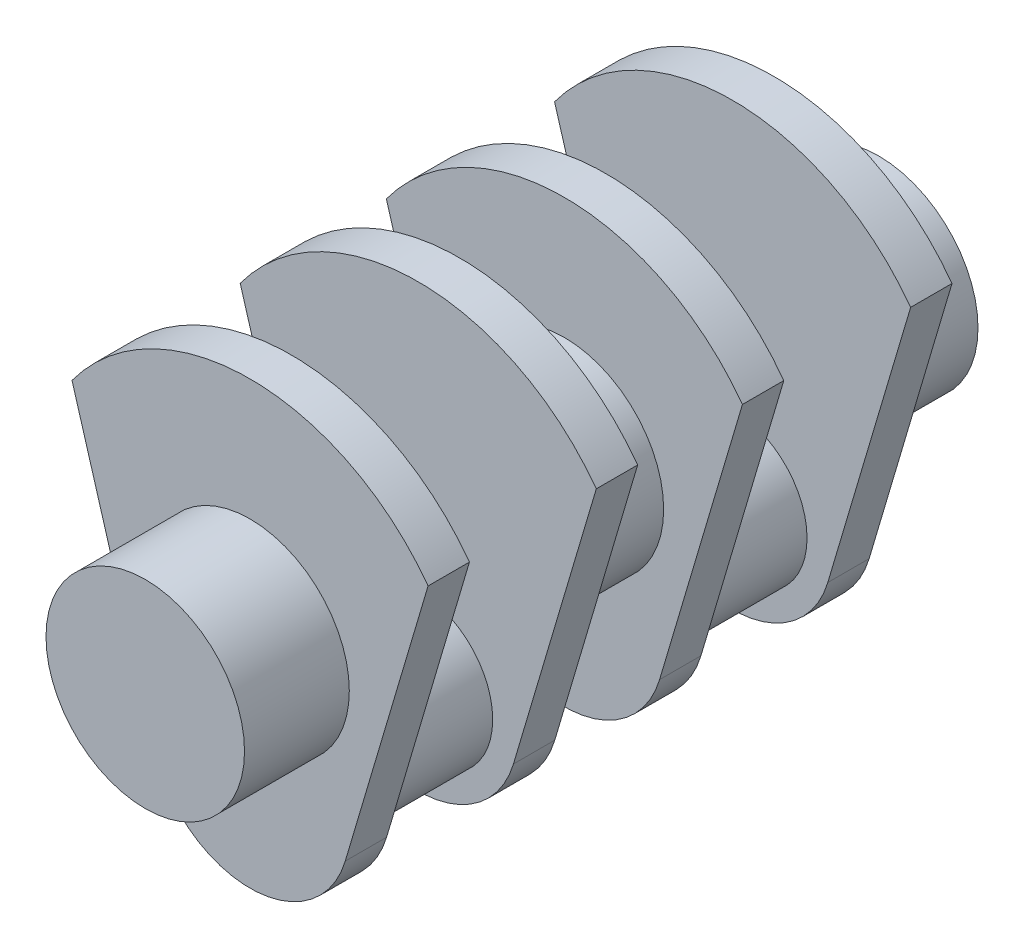
ISO-10303-21;
HEADER;
FILE_DESCRIPTION(('STEP AP214'),'2;1');
FILE_NAME('part.step','',(''),(''),'','','');
FILE_SCHEMA(('AUTOMOTIVE_DESIGN { 1 0 10303 214 1 1 1 1 }'));
ENDSEC;
DATA;
#1=APPLICATION_CONTEXT('core data for automotive mechanical design processes');
#2=APPLICATION_PROTOCOL_DEFINITION('international standard','automotive_design',2000,#1);
#3=PRODUCT_CONTEXT('',#1,'mechanical');
#4=PRODUCT('Part','Part','',(#3));
#5=PRODUCT_RELATED_PRODUCT_CATEGORY('part','',(#4));
#6=PRODUCT_DEFINITION_FORMATION('','',#4);
#7=PRODUCT_DEFINITION_CONTEXT('part definition',#1,'design');
#8=PRODUCT_DEFINITION('design','',#6,#7);
#9=PRODUCT_DEFINITION_SHAPE('','',#8);
#10=(LENGTH_UNIT() NAMED_UNIT(*) SI_UNIT(.MILLI.,.METRE.));
#11=(NAMED_UNIT(*) PLANE_ANGLE_UNIT() SI_UNIT($,.RADIAN.));
#12=(NAMED_UNIT(*) SI_UNIT($,.STERADIAN.) SOLID_ANGLE_UNIT());
#13=UNCERTAINTY_MEASURE_WITH_UNIT(LENGTH_MEASURE(1.E-05),#10,'distance_accuracy_value','');
#14=(GEOMETRIC_REPRESENTATION_CONTEXT(3) GLOBAL_UNCERTAINTY_ASSIGNED_CONTEXT((#13)) GLOBAL_UNIT_ASSIGNED_CONTEXT((#10,
#11,#12)) REPRESENTATION_CONTEXT('',''));
#15=CARTESIAN_POINT('',(0.,0.,0.));
#16=DIRECTION('',(0.,0.,1.));
#17=DIRECTION('',(1.,0.,0.));
#18=AXIS2_PLACEMENT_3D('',#15,#16,#17);
#19=CARTESIAN_POINT('',(-64.5698934752722,47.2305923802783,15.));
#20=DIRECTION('',(0.958819734868192,0.284015344703924,0.));
#21=DIRECTION('',(-0.284015344703924,0.958819734868193,0.));
#22=AXIS2_PLACEMENT_3D('',#19,#20,#21);
#23=PLANE('',#22);
#24=DIRECTION('',(0.284015344703924,-0.958819734868192,0.));
#25=VECTOR('',#24,1.);
#26=CARTESIAN_POINT('',(-64.5698934752722,47.2305923802783,0.));
#27=LINE('',#26,#25);
#28=CARTESIAN_POINT('',(-64.5698934752722,47.2305923802783,0.));
#29=VERTEX_POINT('',#28);
#30=CARTESIAN_POINT('',(-34.5175104552549,-54.2245524093412,0.));
#31=VERTEX_POINT('',#30);
#32=EDGE_CURVE('E334',#29,#31,#27,.T.);
#33=ORIENTED_EDGE('',*,*,#32,.T.);
#34=DIRECTION('',(0.,0.,-1.));
#35=VECTOR('',#34,1.);
#36=CARTESIAN_POINT('',(-34.5175104552549,-54.2245524093412,15.));
#37=LINE('',#36,#35);
#38=CARTESIAN_POINT('',(-34.5175104552549,-54.2245524093412,15.));
#39=VERTEX_POINT('',#38);
#40=EDGE_CURVE('E48',#39,#31,#37,.T.);
#41=ORIENTED_EDGE('',*,*,#40,.F.);
#42=DIRECTION('',(0.284015344703924,-0.958819734868192,0.));
#43=VECTOR('',#42,1.);
#44=CARTESIAN_POINT('',(-64.5698934752722,47.2305923802783,15.));
#45=LINE('',#44,#43);
#46=CARTESIAN_POINT('',(-64.5698934752722,47.2305923802783,15.));
#47=VERTEX_POINT('',#46);
#48=EDGE_CURVE('E338',#47,#39,#45,.T.);
#49=ORIENTED_EDGE('',*,*,#48,.F.);
#50=DIRECTION('',(0.,0.,-1.));
#51=VECTOR('',#50,1.);
#52=CARTESIAN_POINT('',(-64.5698934752722,47.2305923802783,15.));
#53=LINE('',#52,#51);
#54=EDGE_CURVE('E63',#47,#29,#53,.T.);
#55=ORIENTED_EDGE('',*,*,#54,.T.);
#56=EDGE_LOOP('',(#33,#41,#49,#55));
#57=FACE_BOUND('',#56,.T.);
#58=ADVANCED_FACE('F45',(#57),#23,.F.);
#59=CARTESIAN_POINT('',(0.,-44.,15.));
#60=DIRECTION('',(0.,0.,-1.));
#61=DIRECTION('',(-1.,0.,0.));
#62=AXIS2_PLACEMENT_3D('',#59,#60,#61);
#63=CYLINDRICAL_SURFACE('',#62,36.);
#64=CARTESIAN_POINT('',(0.,-44.,0.));
#65=DIRECTION('',(0.,0.,1.));
#66=DIRECTION('',(1.,0.,0.));
#67=AXIS2_PLACEMENT_3D('',#64,#65,#66);
#68=CIRCLE('',#67,36.);
#69=CARTESIAN_POINT('',(34.517510455255,-54.2245524093412,0.));
#70=VERTEX_POINT('',#69);
#71=EDGE_CURVE('E353',#31,#70,#68,.T.);
#72=ORIENTED_EDGE('',*,*,#71,.T.);
#73=DIRECTION('',(0.,0.,-1.));
#74=VECTOR('',#73,1.);
#75=CARTESIAN_POINT('',(34.517510455255,-54.2245524093412,15.));
#76=LINE('',#75,#74);
#77=CARTESIAN_POINT('',(34.517510455255,-54.2245524093412,15.));
#78=VERTEX_POINT('',#77);
#79=EDGE_CURVE('E367',#78,#70,#76,.T.);
#80=ORIENTED_EDGE('',*,*,#79,.F.);
#81=CARTESIAN_POINT('',(0.,-44.,15.));
#82=DIRECTION('',(0.,0.,1.));
#83=DIRECTION('',(1.,0.,0.));
#84=AXIS2_PLACEMENT_3D('',#81,#82,#83);
#85=CIRCLE('',#84,36.);
#86=EDGE_CURVE('E90',#39,#78,#85,.T.);
#87=ORIENTED_EDGE('',*,*,#86,.F.);
#88=ORIENTED_EDGE('',*,*,#40,.T.);
#89=EDGE_LOOP('',(#72,#80,#87,#88));
#90=FACE_BOUND('',#89,.T.);
#91=ADVANCED_FACE('F372',(#90),#63,.T.);
#92=CARTESIAN_POINT('',(64.5698934752721,47.2305923802784,15.));
#93=DIRECTION('',(0.958819734868193,-0.284015344703923,0.));
#94=DIRECTION('',(0.284015344703923,0.958819734868193,0.));
#95=AXIS2_PLACEMENT_3D('',#92,#93,#94);
#96=PLANE('',#95);
#97=DIRECTION('',(-0.284015344703923,-0.958819734868193,0.));
#98=VECTOR('',#97,1.);
#99=CARTESIAN_POINT('',(64.5698934752721,47.2305923802784,0.));
#100=LINE('',#99,#98);
#101=CARTESIAN_POINT('',(64.5698934752721,47.2305923802784,0.));
#102=VERTEX_POINT('',#101);
#103=EDGE_CURVE('E357',#102,#70,#100,.T.);
#104=ORIENTED_EDGE('',*,*,#103,.F.);
#105=DIRECTION('',(0.,0.,-1.));
#106=VECTOR('',#105,1.);
#107=CARTESIAN_POINT('',(64.5698934752721,47.2305923802784,15.));
#108=LINE('',#107,#106);
#109=CARTESIAN_POINT('',(64.5698934752721,47.2305923802784,15.));
#110=VERTEX_POINT('',#109);
#111=EDGE_CURVE('E78',#110,#102,#108,.T.);
#112=ORIENTED_EDGE('',*,*,#111,.F.);
#113=DIRECTION('',(-0.284015344703923,-0.958819734868193,0.));
#114=VECTOR('',#113,1.);
#115=CARTESIAN_POINT('',(64.5698934752721,47.2305923802784,15.));
#116=LINE('',#115,#114);
#117=EDGE_CURVE('E344',#110,#78,#116,.T.);
#118=ORIENTED_EDGE('',*,*,#117,.T.);
#119=ORIENTED_EDGE('',*,*,#79,.T.);
#120=EDGE_LOOP('',(#104,#112,#118,#119));
#121=FACE_BOUND('',#120,.T.);
#122=ADVANCED_FACE('F378',(#121),#96,.T.);
#123=CARTESIAN_POINT('',(0.,0.,15.));
#124=DIRECTION('',(0.,0.,-1.));
#125=DIRECTION('',(-1.,0.,0.));
#126=AXIS2_PLACEMENT_3D('',#123,#124,#125);
#127=CYLINDRICAL_SURFACE('',#126,80.);
#128=CARTESIAN_POINT('',(0.,0.,0.));
#129=DIRECTION('',(0.,0.,-1.));
#130=DIRECTION('',(-1.,0.,0.));
#131=AXIS2_PLACEMENT_3D('',#128,#129,#130);
#132=CIRCLE('',#131,80.);
#133=EDGE_CURVE('E341',#29,#102,#132,.T.);
#134=ORIENTED_EDGE('',*,*,#133,.F.);
#135=ORIENTED_EDGE('',*,*,#54,.F.);
#136=CARTESIAN_POINT('',(0.,0.,15.));
#137=DIRECTION('',(0.,0.,-1.));
#138=DIRECTION('',(-1.,0.,0.));
#139=AXIS2_PLACEMENT_3D('',#136,#137,#138);
#140=CIRCLE('',#139,80.);
#141=EDGE_CURVE('E348',#47,#110,#140,.T.);
#142=ORIENTED_EDGE('',*,*,#141,.T.);
#143=ORIENTED_EDGE('',*,*,#111,.T.);
#144=EDGE_LOOP('',(#134,#135,#142,#143));
#145=FACE_BOUND('',#144,.T.);
#146=ADVANCED_FACE('F375',(#145),#127,.T.);
#147=CARTESIAN_POINT('',(0.,-44.,15.));
#148=DIRECTION('',(0.,0.,1.));
#149=DIRECTION('',(1.,0.,0.));
#150=AXIS2_PLACEMENT_3D('',#147,#148,#149);
#151=PLANE('',#150);
#152=CARTESIAN_POINT('',(0.,-44.,15.));
#153=DIRECTION('',(0.,0.,1.));
#154=DIRECTION('',(1.,0.,0.));
#155=AXIS2_PLACEMENT_3D('',#152,#153,#154);
#156=CIRCLE('',#155,27.);
#157=CARTESIAN_POINT('',(27.,-44.,15.));
#158=VERTEX_POINT('',#157);
#159=EDGE_CURVE('E328',#158,#158,#156,.T.);
#160=ORIENTED_EDGE('',*,*,#159,.F.);
#161=EDGE_LOOP('',(#160));
#162=FACE_BOUND('',#161,.T.);
#163=ORIENTED_EDGE('',*,*,#48,.T.);
#164=ORIENTED_EDGE('',*,*,#86,.T.);
#165=ORIENTED_EDGE('',*,*,#117,.F.);
#166=ORIENTED_EDGE('',*,*,#141,.F.);
#167=EDGE_LOOP('',(#163,#164,#165,#166));
#168=FACE_BOUND('',#167,.T.);
#169=ADVANCED_FACE('F377',(#162,#168),#151,.T.);
#170=CARTESIAN_POINT('',(0.,-44.,0.));
#171=DIRECTION('',(0.,0.,1.));
#172=DIRECTION('',(1.,0.,0.));
#173=AXIS2_PLACEMENT_3D('',#170,#171,#172);
#174=PLANE('',#173);
#175=CARTESIAN_POINT('',(0.,0.,0.));
#176=DIRECTION('',(0.,0.,-1.));
#177=DIRECTION('',(-1.,0.,0.));
#178=AXIS2_PLACEMENT_3D('',#175,#176,#177);
#179=CIRCLE('',#178,36.);
#180=CARTESIAN_POINT('',(-36.,0.,0.));
#181=VERTEX_POINT('',#180);
#182=EDGE_CURVE('E11',#181,#181,#179,.T.);
#183=ORIENTED_EDGE('',*,*,#182,.F.);
#184=EDGE_LOOP('',(#183));
#185=FACE_BOUND('',#184,.T.);
#186=ORIENTED_EDGE('',*,*,#32,.F.);
#187=ORIENTED_EDGE('',*,*,#133,.T.);
#188=ORIENTED_EDGE('',*,*,#103,.T.);
#189=ORIENTED_EDGE('',*,*,#71,.F.);
#190=EDGE_LOOP('',(#186,#187,#188,#189));
#191=FACE_BOUND('',#190,.T.);
#192=ADVANCED_FACE('F374',(#185,#191),#174,.F.);
#193=CARTESIAN_POINT('',(0.,-44.,61.));
#194=DIRECTION('',(0.,0.,-1.));
#195=DIRECTION('',(-1.,0.,0.));
#196=AXIS2_PLACEMENT_3D('',#193,#194,#195);
#197=CYLINDRICAL_SURFACE('',#196,27.);
#198=CARTESIAN_POINT('',(0.,-44.,61.));
#199=DIRECTION('',(0.,0.,1.));
#200=DIRECTION('',(1.,0.,0.));
#201=AXIS2_PLACEMENT_3D('',#198,#199,#200);
#202=CIRCLE('',#201,27.);
#203=CARTESIAN_POINT('',(27.,-44.,61.));
#204=VERTEX_POINT('',#203);
#205=EDGE_CURVE('E330',#204,#204,#202,.T.);
#206=ORIENTED_EDGE('',*,*,#205,.F.);
#207=EDGE_LOOP('',(#206));
#208=FACE_BOUND('',#207,.T.);
#209=ORIENTED_EDGE('',*,*,#159,.T.);
#210=EDGE_LOOP('',(#209));
#211=FACE_BOUND('',#210,.T.);
#212=ADVANCED_FACE('F420',(#208,#211),#197,.T.);
#213=CARTESIAN_POINT('',(0.,0.,-38.));
#214=DIRECTION('',(0.,0.,1.));
#215=DIRECTION('',(1.,0.,0.));
#216=AXIS2_PLACEMENT_3D('',#213,#214,#215);
#217=CYLINDRICAL_SURFACE('',#216,36.);
#218=CARTESIAN_POINT('',(0.,0.,-38.));
#219=DIRECTION('',(0.,0.,-1.));
#220=DIRECTION('',(-1.,0.,0.));
#221=AXIS2_PLACEMENT_3D('',#218,#219,#220);
#222=CIRCLE('',#221,36.);
#223=CARTESIAN_POINT('',(-36.,0.,-38.));
#224=VERTEX_POINT('',#223);
#225=EDGE_CURVE('E325',#224,#224,#222,.T.);
#226=ORIENTED_EDGE('',*,*,#225,.F.);
#227=EDGE_LOOP('',(#226));
#228=FACE_BOUND('',#227,.T.);
#229=ORIENTED_EDGE('',*,*,#182,.T.);
#230=EDGE_LOOP('',(#229));
#231=FACE_BOUND('',#230,.T.);
#232=ADVANCED_FACE('F429',(#228,#231),#217,.T.);
#233=CARTESIAN_POINT('',(0.,0.,-38.));
#234=DIRECTION('',(0.,0.,-1.));
#235=DIRECTION('',(-1.,0.,0.));
#236=AXIS2_PLACEMENT_3D('',#233,#234,#235);
#237=PLANE('',#236);
#238=ORIENTED_EDGE('',*,*,#225,.T.);
#239=EDGE_LOOP('',(#238));
#240=FACE_BOUND('',#239,.T.);
#241=ADVANCED_FACE('F438',(#240),#237,.T.);
#242=CARTESIAN_POINT('',(-64.5698934752722,47.2305923802783,61.));
#243=DIRECTION('',(-0.958819734868192,-0.284015344703924,0.));
#244=DIRECTION('',(0.284015344703924,-0.958819734868193,0.));
#245=AXIS2_PLACEMENT_3D('',#242,#243,#244);
#246=PLANE('',#245);
#247=DIRECTION('',(0.284015344703924,-0.958819734868192,0.));
#248=VECTOR('',#247,1.);
#249=CARTESIAN_POINT('',(-64.5698934752722,47.2305923802783,76.));
#250=LINE('',#249,#248);
#251=CARTESIAN_POINT('',(-64.5698934752722,47.2305923802783,76.));
#252=VERTEX_POINT('',#251);
#253=CARTESIAN_POINT('',(-34.5175104552549,-54.2245524093412,76.));
#254=VERTEX_POINT('',#253);
#255=EDGE_CURVE('E283',#252,#254,#250,.T.);
#256=ORIENTED_EDGE('',*,*,#255,.F.);
#257=DIRECTION('',(0.,0.,1.));
#258=VECTOR('',#257,1.);
#259=CARTESIAN_POINT('',(-64.5698934752722,47.2305923802783,61.));
#260=LINE('',#259,#258);
#261=CARTESIAN_POINT('',(-64.5698934752722,47.2305923802783,61.));
#262=VERTEX_POINT('',#261);
#263=EDGE_CURVE('E322',#262,#252,#260,.T.);
#264=ORIENTED_EDGE('',*,*,#263,.F.);
#265=DIRECTION('',(0.284015344703924,-0.958819734868192,0.));
#266=VECTOR('',#265,1.);
#267=CARTESIAN_POINT('',(-64.5698934752722,47.2305923802783,61.));
#268=LINE('',#267,#266);
#269=CARTESIAN_POINT('',(-34.5175104552549,-54.2245524093412,61.));
#270=VERTEX_POINT('',#269);
#271=EDGE_CURVE('E284',#262,#270,#268,.T.);
#272=ORIENTED_EDGE('',*,*,#271,.T.);
#273=DIRECTION('',(0.,0.,1.));
#274=VECTOR('',#273,1.);
#275=CARTESIAN_POINT('',(-34.5175104552549,-54.2245524093412,61.));
#276=LINE('',#275,#274);
#277=EDGE_CURVE('E299',#270,#254,#276,.T.);
#278=ORIENTED_EDGE('',*,*,#277,.T.);
#279=EDGE_LOOP('',(#256,#264,#272,#278));
#280=FACE_BOUND('',#279,.T.);
#281=ADVANCED_FACE('F448',(#280),#246,.T.);
#282=CARTESIAN_POINT('',(0.,0.,61.));
#283=DIRECTION('',(0.,0.,1.));
#284=DIRECTION('',(1.,0.,0.));
#285=AXIS2_PLACEMENT_3D('',#282,#283,#284);
#286=CYLINDRICAL_SURFACE('',#285,80.);
#287=CARTESIAN_POINT('',(0.,0.,76.));
#288=DIRECTION('',(0.,0.,-1.));
#289=DIRECTION('',(-1.,0.,0.));
#290=AXIS2_PLACEMENT_3D('',#287,#288,#289);
#291=CIRCLE('',#290,80.);
#292=CARTESIAN_POINT('',(64.5698934752721,47.2305923802784,76.));
#293=VERTEX_POINT('',#292);
#294=EDGE_CURVE('E303',#252,#293,#291,.T.);
#295=ORIENTED_EDGE('',*,*,#294,.T.);
#296=DIRECTION('',(0.,0.,1.));
#297=VECTOR('',#296,1.);
#298=CARTESIAN_POINT('',(64.5698934752721,47.2305923802784,61.));
#299=LINE('',#298,#297);
#300=CARTESIAN_POINT('',(64.5698934752721,47.2305923802784,61.));
#301=VERTEX_POINT('',#300);
#302=EDGE_CURVE('E318',#301,#293,#299,.T.);
#303=ORIENTED_EDGE('',*,*,#302,.F.);
#304=CARTESIAN_POINT('',(0.,0.,61.));
#305=DIRECTION('',(0.,0.,-1.));
#306=DIRECTION('',(-1.,0.,0.));
#307=AXIS2_PLACEMENT_3D('',#304,#305,#306);
#308=CIRCLE('',#307,80.);
#309=EDGE_CURVE('E288',#262,#301,#308,.T.);
#310=ORIENTED_EDGE('',*,*,#309,.F.);
#311=ORIENTED_EDGE('',*,*,#263,.T.);
#312=EDGE_LOOP('',(#295,#303,#310,#311));
#313=FACE_BOUND('',#312,.T.);
#314=ADVANCED_FACE('F458',(#313),#286,.T.);
#315=CARTESIAN_POINT('',(64.5698934752721,47.2305923802784,61.));
#316=DIRECTION('',(-0.958819734868193,0.284015344703923,0.));
#317=DIRECTION('',(-0.284015344703923,-0.958819734868193,0.));
#318=AXIS2_PLACEMENT_3D('',#315,#316,#317);
#319=PLANE('',#318);
#320=DIRECTION('',(-0.284015344703923,-0.958819734868193,0.));
#321=VECTOR('',#320,1.);
#322=CARTESIAN_POINT('',(64.5698934752721,47.2305923802784,76.));
#323=LINE('',#322,#321);
#324=CARTESIAN_POINT('',(34.517510455255,-54.2245524093412,76.));
#325=VERTEX_POINT('',#324);
#326=EDGE_CURVE('E306',#293,#325,#323,.T.);
#327=ORIENTED_EDGE('',*,*,#326,.T.);
#328=DIRECTION('',(0.,0.,1.));
#329=VECTOR('',#328,1.);
#330=CARTESIAN_POINT('',(34.517510455255,-54.2245524093412,61.));
#331=LINE('',#330,#329);
#332=CARTESIAN_POINT('',(34.517510455255,-54.2245524093412,61.));
#333=VERTEX_POINT('',#332);
#334=EDGE_CURVE('E315',#333,#325,#331,.T.);
#335=ORIENTED_EDGE('',*,*,#334,.F.);
#336=DIRECTION('',(-0.284015344703923,-0.958819734868193,0.));
#337=VECTOR('',#336,1.);
#338=CARTESIAN_POINT('',(64.5698934752721,47.2305923802784,61.));
#339=LINE('',#338,#337);
#340=EDGE_CURVE('E292',#301,#333,#339,.T.);
#341=ORIENTED_EDGE('',*,*,#340,.F.);
#342=ORIENTED_EDGE('',*,*,#302,.T.);
#343=EDGE_LOOP('',(#327,#335,#341,#342));
#344=FACE_BOUND('',#343,.T.);
#345=ADVANCED_FACE('F468',(#344),#319,.F.);
#346=CARTESIAN_POINT('',(0.,-44.,61.));
#347=DIRECTION('',(0.,0.,1.));
#348=DIRECTION('',(1.,0.,0.));
#349=AXIS2_PLACEMENT_3D('',#346,#347,#348);
#350=CYLINDRICAL_SURFACE('',#349,36.);
#351=CARTESIAN_POINT('',(0.,-44.,76.));
#352=DIRECTION('',(0.,0.,1.));
#353=DIRECTION('',(1.,0.,0.));
#354=AXIS2_PLACEMENT_3D('',#351,#352,#353);
#355=CIRCLE('',#354,36.);
#356=EDGE_CURVE('E289',#254,#325,#355,.T.);
#357=ORIENTED_EDGE('',*,*,#356,.F.);
#358=ORIENTED_EDGE('',*,*,#277,.F.);
#359=CARTESIAN_POINT('',(0.,-44.,61.));
#360=DIRECTION('',(0.,0.,1.));
#361=DIRECTION('',(1.,0.,0.));
#362=AXIS2_PLACEMENT_3D('',#359,#360,#361);
#363=CIRCLE('',#362,36.);
#364=EDGE_CURVE('E295',#270,#333,#363,.T.);
#365=ORIENTED_EDGE('',*,*,#364,.T.);
#366=ORIENTED_EDGE('',*,*,#334,.T.);
#367=EDGE_LOOP('',(#357,#358,#365,#366));
#368=FACE_BOUND('',#367,.T.);
#369=ADVANCED_FACE('F478',(#368),#350,.T.);
#370=CARTESIAN_POINT('',(0.,-44.,61.));
#371=DIRECTION('',(0.,0.,-1.));
#372=DIRECTION('',(1.,0.,0.));
#373=AXIS2_PLACEMENT_3D('',#370,#371,#372);
#374=PLANE('',#373);
#375=ORIENTED_EDGE('',*,*,#205,.T.);
#376=EDGE_LOOP('',(#375));
#377=FACE_BOUND('',#376,.T.);
#378=ORIENTED_EDGE('',*,*,#271,.F.);
#379=ORIENTED_EDGE('',*,*,#309,.T.);
#380=ORIENTED_EDGE('',*,*,#340,.T.);
#381=ORIENTED_EDGE('',*,*,#364,.F.);
#382=EDGE_LOOP('',(#378,#379,#380,#381));
#383=FACE_BOUND('',#382,.T.);
#384=ADVANCED_FACE('F488',(#377,#383),#374,.T.);
#385=CARTESIAN_POINT('',(0.,-44.,76.));
#386=DIRECTION('',(0.,0.,-1.));
#387=DIRECTION('',(1.,0.,0.));
#388=AXIS2_PLACEMENT_3D('',#385,#386,#387);
#389=PLANE('',#388);
#390=CARTESIAN_POINT('',(0.,0.,76.));
#391=DIRECTION('',(0.,0.,-1.));
#392=DIRECTION('',(-1.,0.,0.));
#393=AXIS2_PLACEMENT_3D('',#390,#391,#392);
#394=CIRCLE('',#393,36.);
#395=CARTESIAN_POINT('',(-36.,0.,76.));
#396=VERTEX_POINT('',#395);
#397=EDGE_CURVE('E279',#396,#396,#394,.T.);
#398=ORIENTED_EDGE('',*,*,#397,.T.);
#399=EDGE_LOOP('',(#398));
#400=FACE_BOUND('',#399,.T.);
#401=ORIENTED_EDGE('',*,*,#255,.T.);
#402=ORIENTED_EDGE('',*,*,#356,.T.);
#403=ORIENTED_EDGE('',*,*,#326,.F.);
#404=ORIENTED_EDGE('',*,*,#294,.F.);
#405=EDGE_LOOP('',(#401,#402,#403,#404));
#406=FACE_BOUND('',#405,.T.);
#407=ADVANCED_FACE('F498',(#400,#406),#389,.F.);
#408=CARTESIAN_POINT('',(0.,0.,114.));
#409=DIRECTION('',(0.,0.,-1.));
#410=DIRECTION('',(-1.,0.,0.));
#411=AXIS2_PLACEMENT_3D('',#408,#409,#410);
#412=CYLINDRICAL_SURFACE('',#411,36.);
#413=CARTESIAN_POINT('',(0.,0.,114.));
#414=DIRECTION('',(0.,0.,-1.));
#415=DIRECTION('',(-1.,0.,0.));
#416=AXIS2_PLACEMENT_3D('',#413,#414,#415);
#417=CIRCLE('',#416,36.);
#418=CARTESIAN_POINT('',(-36.,0.,114.));
#419=VERTEX_POINT('',#418);
#420=EDGE_CURVE('E275',#419,#419,#417,.T.);
#421=ORIENTED_EDGE('',*,*,#420,.T.);
#422=EDGE_LOOP('',(#421));
#423=FACE_BOUND('',#422,.T.);
#424=ORIENTED_EDGE('',*,*,#397,.F.);
#425=EDGE_LOOP('',(#424));
#426=FACE_BOUND('',#425,.T.);
#427=ADVANCED_FACE('F508',(#423,#426),#412,.T.);
#428=CARTESIAN_POINT('',(-64.5698934752722,47.2305923802783,129.));
#429=DIRECTION('',(0.958819734868192,0.284015344703924,0.));
#430=DIRECTION('',(-0.284015344703924,0.958819734868193,0.));
#431=AXIS2_PLACEMENT_3D('',#428,#429,#430);
#432=PLANE('',#431);
#433=DIRECTION('',(0.284015344703924,-0.958819734868192,0.));
#434=VECTOR('',#433,1.);
#435=CARTESIAN_POINT('',(-64.5698934752722,47.2305923802783,114.));
#436=LINE('',#435,#434);
#437=CARTESIAN_POINT('',(-64.5698934752722,47.2305923802783,114.));
#438=VERTEX_POINT('',#437);
#439=CARTESIAN_POINT('',(-34.5175104552549,-54.2245524093412,114.));
#440=VERTEX_POINT('',#439);
#441=EDGE_CURVE('E228',#438,#440,#436,.T.);
#442=ORIENTED_EDGE('',*,*,#441,.T.);
#443=DIRECTION('',(0.,0.,-1.));
#444=VECTOR('',#443,1.);
#445=CARTESIAN_POINT('',(-34.5175104552549,-54.2245524093412,129.));
#446=LINE('',#445,#444);
#447=CARTESIAN_POINT('',(-34.5175104552549,-54.2245524093412,129.));
#448=VERTEX_POINT('',#447);
#449=EDGE_CURVE('E271',#448,#440,#446,.T.);
#450=ORIENTED_EDGE('',*,*,#449,.F.);
#451=DIRECTION('',(0.284015344703924,-0.958819734868192,0.));
#452=VECTOR('',#451,1.);
#453=CARTESIAN_POINT('',(-64.5698934752722,47.2305923802783,129.));
#454=LINE('',#453,#452);
#455=CARTESIAN_POINT('',(-64.5698934752722,47.2305923802783,129.));
#456=VERTEX_POINT('',#455);
#457=EDGE_CURVE('E232',#456,#448,#454,.T.);
#458=ORIENTED_EDGE('',*,*,#457,.F.);
#459=DIRECTION('',(0.,0.,-1.));
#460=VECTOR('',#459,1.);
#461=CARTESIAN_POINT('',(-64.5698934752722,47.2305923802783,129.));
#462=LINE('',#461,#460);
#463=EDGE_CURVE('E248',#456,#438,#462,.T.);
#464=ORIENTED_EDGE('',*,*,#463,.T.);
#465=EDGE_LOOP('',(#442,#450,#458,#464));
#466=FACE_BOUND('',#465,.T.);
#467=ADVANCED_FACE('F518',(#466),#432,.F.);
#468=CARTESIAN_POINT('',(0.,-44.,129.));
#469=DIRECTION('',(0.,0.,-1.));
#470=DIRECTION('',(-1.,0.,0.));
#471=AXIS2_PLACEMENT_3D('',#468,#469,#470);
#472=CYLINDRICAL_SURFACE('',#471,36.);
#473=CARTESIAN_POINT('',(0.,-44.,114.));
#474=DIRECTION('',(0.,0.,1.));
#475=DIRECTION('',(1.,0.,0.));
#476=AXIS2_PLACEMENT_3D('',#473,#474,#475);
#477=CIRCLE('',#476,36.);
#478=CARTESIAN_POINT('',(34.517510455255,-54.2245524093412,114.));
#479=VERTEX_POINT('',#478);
#480=EDGE_CURVE('E252',#440,#479,#477,.T.);
#481=ORIENTED_EDGE('',*,*,#480,.T.);
#482=DIRECTION('',(0.,0.,-1.));
#483=VECTOR('',#482,1.);
#484=CARTESIAN_POINT('',(34.517510455255,-54.2245524093412,129.));
#485=LINE('',#484,#483);
#486=CARTESIAN_POINT('',(34.517510455255,-54.2245524093412,129.));
#487=VERTEX_POINT('',#486);
#488=EDGE_CURVE('E268',#487,#479,#485,.T.);
#489=ORIENTED_EDGE('',*,*,#488,.F.);
#490=CARTESIAN_POINT('',(0.,-44.,129.));
#491=DIRECTION('',(0.,0.,1.));
#492=DIRECTION('',(1.,0.,0.));
#493=AXIS2_PLACEMENT_3D('',#490,#491,#492);
#494=CIRCLE('',#493,36.);
#495=EDGE_CURVE('E236',#448,#487,#494,.T.);
#496=ORIENTED_EDGE('',*,*,#495,.F.);
#497=ORIENTED_EDGE('',*,*,#449,.T.);
#498=EDGE_LOOP('',(#481,#489,#496,#497));
#499=FACE_BOUND('',#498,.T.);
#500=ADVANCED_FACE('F528',(#499),#472,.T.);
#501=CARTESIAN_POINT('',(64.5698934752721,47.2305923802784,129.));
#502=DIRECTION('',(0.958819734868193,-0.284015344703923,0.));
#503=DIRECTION('',(0.284015344703923,0.958819734868193,0.));
#504=AXIS2_PLACEMENT_3D('',#501,#502,#503);
#505=PLANE('',#504);
#506=DIRECTION('',(-0.284015344703923,-0.958819734868193,0.));
#507=VECTOR('',#506,1.);
#508=CARTESIAN_POINT('',(64.5698934752721,47.2305923802784,114.));
#509=LINE('',#508,#507);
#510=CARTESIAN_POINT('',(64.5698934752721,47.2305923802784,114.));
#511=VERTEX_POINT('',#510);
#512=EDGE_CURVE('E256',#511,#479,#509,.T.);
#513=ORIENTED_EDGE('',*,*,#512,.F.);
#514=DIRECTION('',(0.,0.,-1.));
#515=VECTOR('',#514,1.);
#516=CARTESIAN_POINT('',(64.5698934752721,47.2305923802784,129.));
#517=LINE('',#516,#515);
#518=CARTESIAN_POINT('',(64.5698934752721,47.2305923802784,129.));
#519=VERTEX_POINT('',#518);
#520=EDGE_CURVE('E265',#519,#511,#517,.T.);
#521=ORIENTED_EDGE('',*,*,#520,.F.);
#522=DIRECTION('',(-0.284015344703923,-0.958819734868193,0.));
#523=VECTOR('',#522,1.);
#524=CARTESIAN_POINT('',(64.5698934752721,47.2305923802784,129.));
#525=LINE('',#524,#523);
#526=EDGE_CURVE('E240',#519,#487,#525,.T.);
#527=ORIENTED_EDGE('',*,*,#526,.T.);
#528=ORIENTED_EDGE('',*,*,#488,.T.);
#529=EDGE_LOOP('',(#513,#521,#527,#528));
#530=FACE_BOUND('',#529,.T.);
#531=ADVANCED_FACE('F538',(#530),#505,.T.);
#532=CARTESIAN_POINT('',(0.,0.,129.));
#533=DIRECTION('',(0.,0.,-1.));
#534=DIRECTION('',(-1.,0.,0.));
#535=AXIS2_PLACEMENT_3D('',#532,#533,#534);
#536=CYLINDRICAL_SURFACE('',#535,80.);
#537=CARTESIAN_POINT('',(0.,0.,114.));
#538=DIRECTION('',(0.,0.,-1.));
#539=DIRECTION('',(-1.,0.,0.));
#540=AXIS2_PLACEMENT_3D('',#537,#538,#539);
#541=CIRCLE('',#540,80.);
#542=EDGE_CURVE('E237',#438,#511,#541,.T.);
#543=ORIENTED_EDGE('',*,*,#542,.F.);
#544=ORIENTED_EDGE('',*,*,#463,.F.);
#545=CARTESIAN_POINT('',(0.,0.,129.));
#546=DIRECTION('',(0.,0.,-1.));
#547=DIRECTION('',(-1.,0.,0.));
#548=AXIS2_PLACEMENT_3D('',#545,#546,#547);
#549=CIRCLE('',#548,80.);
#550=EDGE_CURVE('E244',#456,#519,#549,.T.);
#551=ORIENTED_EDGE('',*,*,#550,.T.);
#552=ORIENTED_EDGE('',*,*,#520,.T.);
#553=EDGE_LOOP('',(#543,#544,#551,#552));
#554=FACE_BOUND('',#553,.T.);
#555=ADVANCED_FACE('F548',(#554),#536,.T.);
#556=CARTESIAN_POINT('',(0.,-44.,129.));
#557=DIRECTION('',(0.,0.,1.));
#558=DIRECTION('',(1.,0.,0.));
#559=AXIS2_PLACEMENT_3D('',#556,#557,#558);
#560=PLANE('',#559);
#561=CARTESIAN_POINT('',(0.,-44.,129.));
#562=DIRECTION('',(0.,0.,1.));
#563=DIRECTION('',(1.,0.,0.));
#564=AXIS2_PLACEMENT_3D('',#561,#562,#563);
#565=CIRCLE('',#564,27.);
#566=CARTESIAN_POINT('',(27.,-44.,129.));
#567=VERTEX_POINT('',#566);
#568=EDGE_CURVE('E177',#567,#567,#565,.T.);
#569=ORIENTED_EDGE('',*,*,#568,.F.);
#570=EDGE_LOOP('',(#569));
#571=FACE_BOUND('',#570,.T.);
#572=ORIENTED_EDGE('',*,*,#457,.T.);
#573=ORIENTED_EDGE('',*,*,#495,.T.);
#574=ORIENTED_EDGE('',*,*,#526,.F.);
#575=ORIENTED_EDGE('',*,*,#550,.F.);
#576=EDGE_LOOP('',(#572,#573,#574,#575));
#577=FACE_BOUND('',#576,.T.);
#578=ADVANCED_FACE('F558',(#571,#577),#560,.T.);
#579=CARTESIAN_POINT('',(0.,-44.,114.));
#580=DIRECTION('',(0.,0.,1.));
#581=DIRECTION('',(1.,0.,0.));
#582=AXIS2_PLACEMENT_3D('',#579,#580,#581);
#583=PLANE('',#582);
#584=ORIENTED_EDGE('',*,*,#420,.F.);
#585=EDGE_LOOP('',(#584));
#586=FACE_BOUND('',#585,.T.);
#587=ORIENTED_EDGE('',*,*,#441,.F.);
#588=ORIENTED_EDGE('',*,*,#542,.T.);
#589=ORIENTED_EDGE('',*,*,#512,.T.);
#590=ORIENTED_EDGE('',*,*,#480,.F.);
#591=EDGE_LOOP('',(#587,#588,#589,#590));
#592=FACE_BOUND('',#591,.T.);
#593=ADVANCED_FACE('F568',(#586,#592),#583,.F.);
#594=CARTESIAN_POINT('',(0.,-44.,175.));
#595=DIRECTION('',(0.,0.,-1.));
#596=DIRECTION('',(-1.,0.,0.));
#597=AXIS2_PLACEMENT_3D('',#594,#595,#596);
#598=CYLINDRICAL_SURFACE('',#597,27.);
#599=CARTESIAN_POINT('',(0.,-44.,175.));
#600=DIRECTION('',(0.,0.,1.));
#601=DIRECTION('',(1.,0.,0.));
#602=AXIS2_PLACEMENT_3D('',#599,#600,#601);
#603=CIRCLE('',#602,27.);
#604=CARTESIAN_POINT('',(27.,-44.,175.));
#605=VERTEX_POINT('',#604);
#606=EDGE_CURVE('E224',#605,#605,#603,.T.);
#607=ORIENTED_EDGE('',*,*,#606,.F.);
#608=EDGE_LOOP('',(#607));
#609=FACE_BOUND('',#608,.T.);
#610=ORIENTED_EDGE('',*,*,#568,.T.);
#611=EDGE_LOOP('',(#610));
#612=FACE_BOUND('',#611,.T.);
#613=ADVANCED_FACE('F578',(#609,#612),#598,.T.);
#614=CARTESIAN_POINT('',(-64.5698934752722,47.2305923802783,175.));
#615=DIRECTION('',(-0.958819734868192,-0.284015344703924,0.));
#616=DIRECTION('',(0.284015344703924,-0.958819734868193,0.));
#617=AXIS2_PLACEMENT_3D('',#614,#615,#616);
#618=PLANE('',#617);
#619=DIRECTION('',(0.284015344703924,-0.958819734868192,0.));
#620=VECTOR('',#619,1.);
#621=CARTESIAN_POINT('',(-64.5698934752722,47.2305923802783,190.));
#622=LINE('',#621,#620);
#623=CARTESIAN_POINT('',(-64.5698934752722,47.2305923802783,190.));
#624=VERTEX_POINT('',#623);
#625=CARTESIAN_POINT('',(-34.5175104552549,-54.2245524093412,190.));
#626=VERTEX_POINT('',#625);
#627=EDGE_CURVE('E173',#624,#626,#622,.T.);
#628=ORIENTED_EDGE('',*,*,#627,.F.);
#629=DIRECTION('',(0.,0.,1.));
#630=VECTOR('',#629,1.);
#631=CARTESIAN_POINT('',(-64.5698934752722,47.2305923802783,175.));
#632=LINE('',#631,#630);
#633=CARTESIAN_POINT('',(-64.5698934752722,47.2305923802783,175.));
#634=VERTEX_POINT('',#633);
#635=EDGE_CURVE('E166',#634,#624,#632,.T.);
#636=ORIENTED_EDGE('',*,*,#635,.F.);
#637=DIRECTION('',(0.284015344703924,-0.958819734868192,0.));
#638=VECTOR('',#637,1.);
#639=CARTESIAN_POINT('',(-64.5698934752722,47.2305923802783,175.));
#640=LINE('',#639,#638);
#641=CARTESIAN_POINT('',(-34.5175104552549,-54.2245524093412,175.));
#642=VERTEX_POINT('',#641);
#643=EDGE_CURVE('E170',#634,#642,#640,.T.);
#644=ORIENTED_EDGE('',*,*,#643,.T.);
#645=DIRECTION('',(0.,0.,1.));
#646=VECTOR('',#645,1.);
#647=CARTESIAN_POINT('',(-34.5175104552549,-54.2245524093412,175.));
#648=LINE('',#647,#646);
#649=EDGE_CURVE('E207',#642,#626,#648,.T.);
#650=ORIENTED_EDGE('',*,*,#649,.T.);
#651=EDGE_LOOP('',(#628,#636,#644,#650));
#652=FACE_BOUND('',#651,.T.);
#653=ADVANCED_FACE('F168',(#652),#618,.T.);
#654=CARTESIAN_POINT('',(0.,0.,175.));
#655=DIRECTION('',(0.,0.,1.));
#656=DIRECTION('',(1.,0.,0.));
#657=AXIS2_PLACEMENT_3D('',#654,#655,#656);
#658=CYLINDRICAL_SURFACE('',#657,80.);
#659=CARTESIAN_POINT('',(0.,0.,190.));
#660=DIRECTION('',(0.,0.,-1.));
#661=DIRECTION('',(-1.,0.,0.));
#662=AXIS2_PLACEMENT_3D('',#659,#660,#661);
#663=CIRCLE('',#662,80.);
#664=CARTESIAN_POINT('',(64.5698934752721,47.2305923802784,190.));
#665=VERTEX_POINT('',#664);
#666=EDGE_CURVE('E210',#624,#665,#663,.T.);
#667=ORIENTED_EDGE('',*,*,#666,.T.);
#668=DIRECTION('',(0.,0.,1.));
#669=VECTOR('',#668,1.);
#670=CARTESIAN_POINT('',(64.5698934752721,47.2305923802784,175.));
#671=LINE('',#670,#669);
#672=CARTESIAN_POINT('',(64.5698934752721,47.2305923802784,175.));
#673=VERTEX_POINT('',#672);
#674=EDGE_CURVE('E178',#673,#665,#671,.T.);
#675=ORIENTED_EDGE('',*,*,#674,.F.);
#676=CARTESIAN_POINT('',(0.,0.,175.));
#677=DIRECTION('',(0.,0.,-1.));
#678=DIRECTION('',(-1.,0.,0.));
#679=AXIS2_PLACEMENT_3D('',#676,#677,#678);
#680=CIRCLE('',#679,80.);
#681=EDGE_CURVE('E181',#634,#673,#680,.T.);
#682=ORIENTED_EDGE('',*,*,#681,.F.);
#683=ORIENTED_EDGE('',*,*,#635,.T.);
#684=EDGE_LOOP('',(#667,#675,#682,#683));
#685=FACE_BOUND('',#684,.T.);
#686=ADVANCED_FACE('F182',(#685),#658,.T.);
#687=CARTESIAN_POINT('',(64.5698934752721,47.2305923802784,175.));
#688=DIRECTION('',(-0.958819734868193,0.284015344703923,0.));
#689=DIRECTION('',(-0.284015344703923,-0.958819734868193,0.));
#690=AXIS2_PLACEMENT_3D('',#687,#688,#689);
#691=PLANE('',#690);
#692=DIRECTION('',(-0.284015344703923,-0.958819734868193,0.));
#693=VECTOR('',#692,1.);
#694=CARTESIAN_POINT('',(64.5698934752721,47.2305923802784,190.));
#695=LINE('',#694,#693);
#696=CARTESIAN_POINT('',(34.517510455255,-54.2245524093412,190.));
#697=VERTEX_POINT('',#696);
#698=EDGE_CURVE('E197',#665,#697,#695,.T.);
#699=ORIENTED_EDGE('',*,*,#698,.T.);
#700=DIRECTION('',(0.,0.,1.));
#701=VECTOR('',#700,1.);
#702=CARTESIAN_POINT('',(34.517510455255,-54.2245524093412,175.));
#703=LINE('',#702,#701);
#704=CARTESIAN_POINT('',(34.517510455255,-54.2245524093412,175.));
#705=VERTEX_POINT('',#704);
#706=EDGE_CURVE('E219',#705,#697,#703,.T.);
#707=ORIENTED_EDGE('',*,*,#706,.F.);
#708=DIRECTION('',(-0.284015344703923,-0.958819734868193,0.));
#709=VECTOR('',#708,1.);
#710=CARTESIAN_POINT('',(64.5698934752721,47.2305923802784,175.));
#711=LINE('',#710,#709);
#712=EDGE_CURVE('E187',#673,#705,#711,.T.);
#713=ORIENTED_EDGE('',*,*,#712,.F.);
#714=ORIENTED_EDGE('',*,*,#674,.T.);
#715=EDGE_LOOP('',(#699,#707,#713,#714));
#716=FACE_BOUND('',#715,.T.);
#717=ADVANCED_FACE('F605',(#716),#691,.F.);
#718=CARTESIAN_POINT('',(0.,-44.,175.));
#719=DIRECTION('',(0.,0.,1.));
#720=DIRECTION('',(1.,0.,0.));
#721=AXIS2_PLACEMENT_3D('',#718,#719,#720);
#722=CYLINDRICAL_SURFACE('',#721,36.);
#723=CARTESIAN_POINT('',(0.,-44.,190.));
#724=DIRECTION('',(0.,0.,1.));
#725=DIRECTION('',(1.,0.,0.));
#726=AXIS2_PLACEMENT_3D('',#723,#724,#725);
#727=CIRCLE('',#726,36.);
#728=EDGE_CURVE('E193',#626,#697,#727,.T.);
#729=ORIENTED_EDGE('',*,*,#728,.F.);
#730=ORIENTED_EDGE('',*,*,#649,.F.);
#731=CARTESIAN_POINT('',(0.,-44.,175.));
#732=DIRECTION('',(0.,0.,1.));
#733=DIRECTION('',(1.,0.,0.));
#734=AXIS2_PLACEMENT_3D('',#731,#732,#733);
#735=CIRCLE('',#734,36.);
#736=EDGE_CURVE('E191',#642,#705,#735,.T.);
#737=ORIENTED_EDGE('',*,*,#736,.T.);
#738=ORIENTED_EDGE('',*,*,#706,.T.);
#739=EDGE_LOOP('',(#729,#730,#737,#738));
#740=FACE_BOUND('',#739,.T.);
#741=ADVANCED_FACE('F614',(#740),#722,.T.);
#742=CARTESIAN_POINT('',(0.,-44.,175.));
#743=DIRECTION('',(0.,0.,-1.));
#744=DIRECTION('',(1.,0.,0.));
#745=AXIS2_PLACEMENT_3D('',#742,#743,#744);
#746=PLANE('',#745);
#747=ORIENTED_EDGE('',*,*,#606,.T.);
#748=EDGE_LOOP('',(#747));
#749=FACE_BOUND('',#748,.T.);
#750=ORIENTED_EDGE('',*,*,#643,.F.);
#751=ORIENTED_EDGE('',*,*,#681,.T.);
#752=ORIENTED_EDGE('',*,*,#712,.T.);
#753=ORIENTED_EDGE('',*,*,#736,.F.);
#754=EDGE_LOOP('',(#750,#751,#752,#753));
#755=FACE_BOUND('',#754,.T.);
#756=ADVANCED_FACE('F189',(#749,#755),#746,.T.);
#757=CARTESIAN_POINT('',(0.,-44.,190.));
#758=DIRECTION('',(0.,0.,-1.));
#759=DIRECTION('',(1.,0.,0.));
#760=AXIS2_PLACEMENT_3D('',#757,#758,#759);
#761=PLANE('',#760);
#762=CARTESIAN_POINT('',(0.,0.,190.));
#763=DIRECTION('',(0.,0.,-1.));
#764=DIRECTION('',(-1.,0.,0.));
#765=AXIS2_PLACEMENT_3D('',#762,#763,#764);
#766=CIRCLE('',#765,36.);
#767=CARTESIAN_POINT('',(-36.,0.,190.));
#768=VERTEX_POINT('',#767);
#769=EDGE_CURVE('E200',#768,#768,#766,.T.);
#770=ORIENTED_EDGE('',*,*,#769,.T.);
#771=EDGE_LOOP('',(#770));
#772=FACE_BOUND('',#771,.T.);
#773=ORIENTED_EDGE('',*,*,#627,.T.);
#774=ORIENTED_EDGE('',*,*,#728,.T.);
#775=ORIENTED_EDGE('',*,*,#698,.F.);
#776=ORIENTED_EDGE('',*,*,#666,.F.);
#777=EDGE_LOOP('',(#773,#774,#775,#776));
#778=FACE_BOUND('',#777,.T.);
#779=ADVANCED_FACE('F633',(#772,#778),#761,.F.);
#780=CARTESIAN_POINT('',(0.,0.,228.));
#781=DIRECTION('',(0.,0.,-1.));
#782=DIRECTION('',(-1.,0.,0.));
#783=AXIS2_PLACEMENT_3D('',#780,#781,#782);
#784=CYLINDRICAL_SURFACE('',#783,36.);
#785=CARTESIAN_POINT('',(0.,0.,228.));
#786=DIRECTION('',(0.,0.,-1.));
#787=DIRECTION('',(-1.,0.,0.));
#788=AXIS2_PLACEMENT_3D('',#785,#786,#787);
#789=CIRCLE('',#788,36.);
#790=CARTESIAN_POINT('',(-36.,0.,228.));
#791=VERTEX_POINT('',#790);
#792=EDGE_CURVE('E211',#791,#791,#789,.T.);
#793=ORIENTED_EDGE('',*,*,#792,.T.);
#794=EDGE_LOOP('',(#793));
#795=FACE_BOUND('',#794,.T.);
#796=ORIENTED_EDGE('',*,*,#769,.F.);
#797=EDGE_LOOP('',(#796));
#798=FACE_BOUND('',#797,.T.);
#799=ADVANCED_FACE('F643',(#795,#798),#784,.T.);
#800=CARTESIAN_POINT('',(0.,0.,228.));
#801=DIRECTION('',(0.,0.,1.));
#802=DIRECTION('',(-1.,0.,0.));
#803=AXIS2_PLACEMENT_3D('',#800,#801,#802);
#804=PLANE('',#803);
#805=ORIENTED_EDGE('',*,*,#792,.F.);
#806=EDGE_LOOP('',(#805));
#807=FACE_BOUND('',#806,.T.);
#808=ADVANCED_FACE('F653',(#807),#804,.T.);
#809=CLOSED_SHELL('',(#58,#91,#122,#146,#169,#192,#212,#232,#241,#281,#314,#345,#369,#384,#407,
#427,#467,#500,#531,#555,#578,#593,#613,#653,#686,#717,#741,#756,#779,#799,#808));
#810=MANIFOLD_SOLID_BREP('B2',#809);
#811=ADVANCED_BREP_SHAPE_REPRESENTATION('',(#18,#810),#14);
#812=SHAPE_DEFINITION_REPRESENTATION(#9,#811);
ENDSEC;
END-ISO-10303-21;
